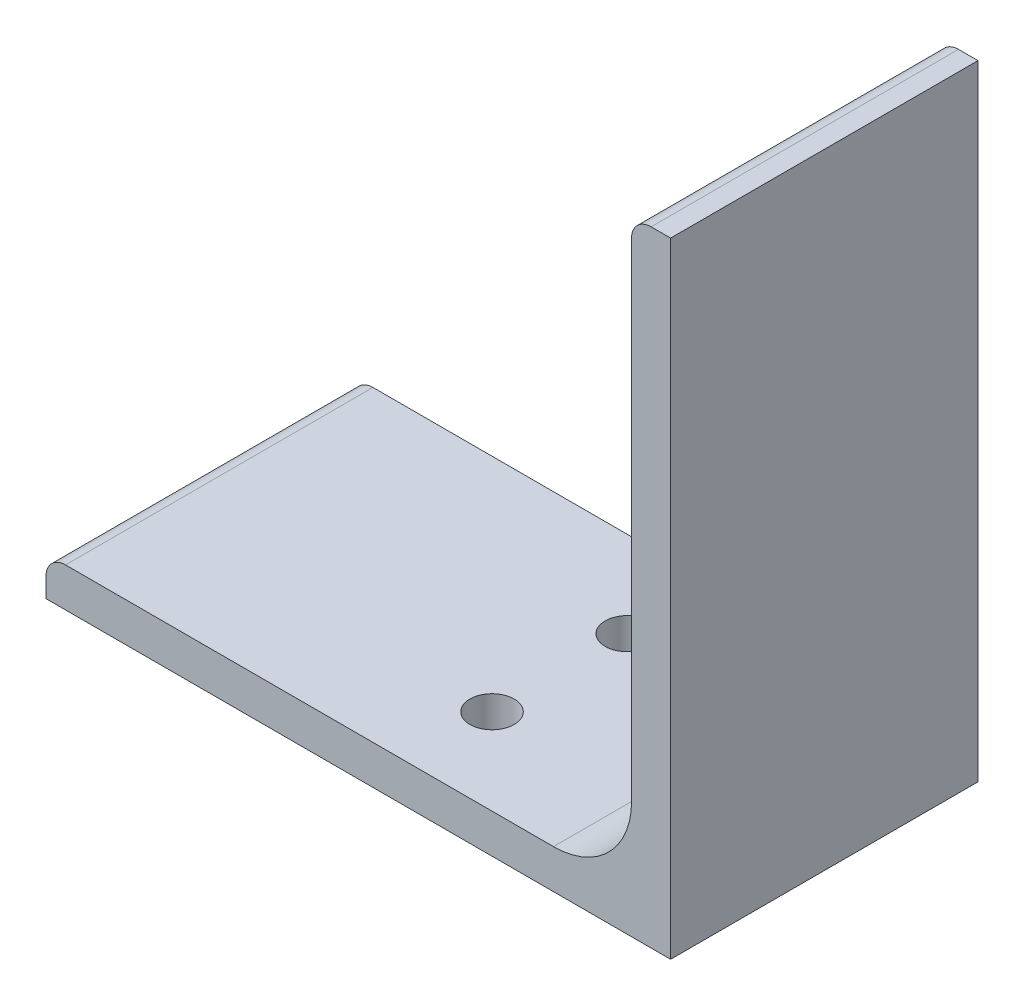
ISO-10303-21;
HEADER;
FILE_DESCRIPTION(('STEP AP214'),'2;1');
FILE_NAME('part.step','',(''),(''),'','','');
FILE_SCHEMA(('AUTOMOTIVE_DESIGN { 1 0 10303 214 1 1 1 1 }'));
ENDSEC;
DATA;
#1=APPLICATION_CONTEXT('core data for automotive mechanical design processes');
#2=APPLICATION_PROTOCOL_DEFINITION('international standard','automotive_design',2000,#1);
#3=PRODUCT_CONTEXT('',#1,'mechanical');
#4=PRODUCT('Part','Part','',(#3));
#5=PRODUCT_RELATED_PRODUCT_CATEGORY('part','',(#4));
#6=PRODUCT_DEFINITION_FORMATION('','',#4);
#7=PRODUCT_DEFINITION_CONTEXT('part definition',#1,'design');
#8=PRODUCT_DEFINITION('design','',#6,#7);
#9=PRODUCT_DEFINITION_SHAPE('','',#8);
#10=(LENGTH_UNIT() NAMED_UNIT(*) SI_UNIT(.MILLI.,.METRE.));
#11=(NAMED_UNIT(*) PLANE_ANGLE_UNIT() SI_UNIT($,.RADIAN.));
#12=(NAMED_UNIT(*) SI_UNIT($,.STERADIAN.) SOLID_ANGLE_UNIT());
#13=UNCERTAINTY_MEASURE_WITH_UNIT(LENGTH_MEASURE(1.E-05),#10,'distance_accuracy_value','');
#14=(GEOMETRIC_REPRESENTATION_CONTEXT(3) GLOBAL_UNCERTAINTY_ASSIGNED_CONTEXT((#13)) GLOBAL_UNIT_ASSIGNED_CONTEXT((#10,
#11,#12)) REPRESENTATION_CONTEXT('',''));
#15=CARTESIAN_POINT('',(0.,0.,0.));
#16=DIRECTION('',(0.,0.,1.));
#17=DIRECTION('',(1.,0.,0.));
#18=AXIS2_PLACEMENT_3D('',#15,#16,#17);
#19=CARTESIAN_POINT('',(-25.4,-23.8125,12.500000019));
#20=DIRECTION('',(1.,0.,0.));
#21=DIRECTION('',(0.,1.,0.));
#22=AXIS2_PLACEMENT_3D('',#19,#20,#21);
#23=PLANE('',#22);
#24=DIRECTION('',(0.,-1.,0.));
#25=VECTOR('',#24,1.);
#26=CARTESIAN_POINT('',(-25.4,-23.8125,-12.500000019));
#27=LINE('',#26,#25);
#28=CARTESIAN_POINT('',(-25.4,-23.8125,-12.500000019));
#29=VERTEX_POINT('',#28);
#30=CARTESIAN_POINT('',(-25.4,-25.4,-12.500000019));
#31=VERTEX_POINT('',#30);
#32=EDGE_CURVE('E137',#29,#31,#27,.T.);
#33=ORIENTED_EDGE('',*,*,#32,.T.);
#34=DIRECTION('',(0.,0.,-1.));
#35=VECTOR('',#34,1.);
#36=CARTESIAN_POINT('',(-25.4,-25.4,12.500000019));
#37=LINE('',#36,#35);
#38=CARTESIAN_POINT('',(-25.4,-25.4,12.500000019));
#39=VERTEX_POINT('',#38);
#40=EDGE_CURVE('E11',#39,#31,#37,.T.);
#41=ORIENTED_EDGE('',*,*,#40,.F.);
#42=DIRECTION('',(0.,-1.,0.));
#43=VECTOR('',#42,1.);
#44=CARTESIAN_POINT('',(-25.4,-23.8125,12.500000019));
#45=LINE('',#44,#43);
#46=CARTESIAN_POINT('',(-25.4,-23.8125,12.500000019));
#47=VERTEX_POINT('',#46);
#48=EDGE_CURVE('E154',#47,#39,#45,.T.);
#49=ORIENTED_EDGE('',*,*,#48,.F.);
#50=DIRECTION('',(0.,0.,-1.));
#51=VECTOR('',#50,1.);
#52=CARTESIAN_POINT('',(-25.4,-23.8125,12.500000019));
#53=LINE('',#52,#51);
#54=EDGE_CURVE('E133',#47,#29,#53,.T.);
#55=ORIENTED_EDGE('',*,*,#54,.T.);
#56=EDGE_LOOP('',(#33,#41,#49,#55));
#57=FACE_BOUND('',#56,.T.);
#58=ADVANCED_FACE('F35',(#57),#23,.F.);
#59=CARTESIAN_POINT('',(-25.4,-25.4,12.500000019));
#60=DIRECTION('',(0.,1.,0.));
#61=DIRECTION('',(-1.,0.,0.));
#62=AXIS2_PLACEMENT_3D('',#59,#60,#61);
#63=PLANE('',#62);
#64=CARTESIAN_POINT('',(3.87500012399999,-25.4,-5.500000049));
#65=DIRECTION('',(0.,1.,0.));
#66=DIRECTION('',(0.,0.,1.));
#67=AXIS2_PLACEMENT_3D('',#64,#65,#66);
#68=CIRCLE('',#67,1.8);
#69=CARTESIAN_POINT('',(3.87500012399999,-25.4,-3.700000049));
#70=VERTEX_POINT('',#69);
#71=EDGE_CURVE('E200',#70,#70,#68,.T.);
#72=ORIENTED_EDGE('',*,*,#71,.T.);
#73=EDGE_LOOP('',(#72));
#74=FACE_BOUND('',#73,.T.);
#75=CARTESIAN_POINT('',(3.87500012399999,-25.4,5.500000049));
#76=DIRECTION('',(0.,1.,0.));
#77=DIRECTION('',(0.,0.,1.));
#78=AXIS2_PLACEMENT_3D('',#75,#76,#77);
#79=CIRCLE('',#78,1.8);
#80=CARTESIAN_POINT('',(3.87500012399999,-25.4,7.300000049));
#81=VERTEX_POINT('',#80);
#82=EDGE_CURVE('E141',#81,#81,#79,.T.);
#83=ORIENTED_EDGE('',*,*,#82,.T.);
#84=EDGE_LOOP('',(#83));
#85=FACE_BOUND('',#84,.T.);
#86=DIRECTION('',(1.,0.,0.));
#87=VECTOR('',#86,1.);
#88=CARTESIAN_POINT('',(-25.4,-25.4,-12.500000019));
#89=LINE('',#88,#87);
#90=CARTESIAN_POINT('',(25.4,-25.4,-12.500000019));
#91=VERTEX_POINT('',#90);
#92=EDGE_CURVE('E140',#31,#91,#89,.T.);
#93=ORIENTED_EDGE('',*,*,#92,.T.);
#94=DIRECTION('',(0.,0.,-1.));
#95=VECTOR('',#94,1.);
#96=CARTESIAN_POINT('',(25.4,-25.4,12.500000019));
#97=LINE('',#96,#95);
#98=CARTESIAN_POINT('',(25.4,-25.4,12.500000019));
#99=VERTEX_POINT('',#98);
#100=EDGE_CURVE('E43',#99,#91,#97,.T.);
#101=ORIENTED_EDGE('',*,*,#100,.F.);
#102=DIRECTION('',(1.,0.,0.));
#103=VECTOR('',#102,1.);
#104=CARTESIAN_POINT('',(-25.4,-25.4,12.500000019));
#105=LINE('',#104,#103);
#106=EDGE_CURVE('E97',#39,#99,#105,.T.);
#107=ORIENTED_EDGE('',*,*,#106,.F.);
#108=ORIENTED_EDGE('',*,*,#40,.T.);
#109=EDGE_LOOP('',(#93,#101,#107,#108));
#110=FACE_BOUND('',#109,.T.);
#111=ADVANCED_FACE('F229',(#74,#85,#110),#63,.F.);
#112=CARTESIAN_POINT('',(25.4,-25.4,12.500000019));
#113=DIRECTION('',(-1.,0.,0.));
#114=DIRECTION('',(0.,-1.,0.));
#115=AXIS2_PLACEMENT_3D('',#112,#113,#114);
#116=PLANE('',#115);
#117=DIRECTION('',(0.,1.,0.));
#118=VECTOR('',#117,1.);
#119=CARTESIAN_POINT('',(25.4,-25.4,-12.500000019));
#120=LINE('',#119,#118);
#121=CARTESIAN_POINT('',(25.4,25.4,-12.500000019));
#122=VERTEX_POINT('',#121);
#123=EDGE_CURVE('E143',#91,#122,#120,.T.);
#124=ORIENTED_EDGE('',*,*,#123,.T.);
#125=DIRECTION('',(0.,0.,-1.));
#126=VECTOR('',#125,1.);
#127=CARTESIAN_POINT('',(25.4,25.4,12.500000019));
#128=LINE('',#127,#126);
#129=CARTESIAN_POINT('',(25.4,25.4,12.500000019));
#130=VERTEX_POINT('',#129);
#131=EDGE_CURVE('E164',#130,#122,#128,.T.);
#132=ORIENTED_EDGE('',*,*,#131,.F.);
#133=DIRECTION('',(0.,1.,0.));
#134=VECTOR('',#133,1.);
#135=CARTESIAN_POINT('',(25.4,-25.4,12.500000019));
#136=LINE('',#135,#134);
#137=EDGE_CURVE('E172',#99,#130,#136,.T.);
#138=ORIENTED_EDGE('',*,*,#137,.F.);
#139=ORIENTED_EDGE('',*,*,#100,.T.);
#140=EDGE_LOOP('',(#124,#132,#138,#139));
#141=FACE_BOUND('',#140,.T.);
#142=ADVANCED_FACE('F170',(#141),#116,.F.);
#143=CARTESIAN_POINT('',(23.8125,25.4,12.500000019));
#144=DIRECTION('',(0.,-1.,0.));
#145=DIRECTION('',(1.,0.,0.));
#146=AXIS2_PLACEMENT_3D('',#143,#144,#145);
#147=PLANE('',#146);
#148=DIRECTION('',(-1.,0.,0.));
#149=VECTOR('',#148,1.);
#150=CARTESIAN_POINT('',(23.8125,25.4,-12.500000019));
#151=LINE('',#150,#149);
#152=CARTESIAN_POINT('',(23.8125,25.4,-12.500000019));
#153=VERTEX_POINT('',#152);
#154=EDGE_CURVE('E145',#122,#153,#151,.T.);
#155=ORIENTED_EDGE('',*,*,#154,.T.);
#156=DIRECTION('',(0.,0.,-1.));
#157=VECTOR('',#156,1.);
#158=CARTESIAN_POINT('',(23.8125,25.4,12.500000019));
#159=LINE('',#158,#157);
#160=CARTESIAN_POINT('',(23.8125,25.4,12.500000019));
#161=VERTEX_POINT('',#160);
#162=EDGE_CURVE('E161',#161,#153,#159,.T.);
#163=ORIENTED_EDGE('',*,*,#162,.F.);
#164=DIRECTION('',(-1.,0.,0.));
#165=VECTOR('',#164,1.);
#166=CARTESIAN_POINT('',(23.8125,25.4,12.500000019));
#167=LINE('',#166,#165);
#168=EDGE_CURVE('E188',#130,#161,#167,.T.);
#169=ORIENTED_EDGE('',*,*,#168,.F.);
#170=ORIENTED_EDGE('',*,*,#131,.T.);
#171=EDGE_LOOP('',(#155,#163,#169,#170));
#172=FACE_BOUND('',#171,.T.);
#173=ADVANCED_FACE('F181',(#172),#147,.F.);
#174=CARTESIAN_POINT('',(23.8125,23.8125,12.500000019));
#175=DIRECTION('',(0.,0.,-1.));
#176=DIRECTION('',(-1.,0.,0.));
#177=AXIS2_PLACEMENT_3D('',#174,#175,#176);
#178=CYLINDRICAL_SURFACE('',#177,1.58750000000001);
#179=CARTESIAN_POINT('',(23.8125,23.8125,-12.500000019));
#180=DIRECTION('',(0.,0.,1.));
#181=DIRECTION('',(-1.,0.,0.));
#182=AXIS2_PLACEMENT_3D('',#179,#180,#181);
#183=CIRCLE('',#182,1.58750000000001);
#184=CARTESIAN_POINT('',(22.225,23.8125,-12.500000019));
#185=VERTEX_POINT('',#184);
#186=EDGE_CURVE('E147',#153,#185,#183,.T.);
#187=ORIENTED_EDGE('',*,*,#186,.T.);
#188=DIRECTION('',(0.,0.,-1.));
#189=VECTOR('',#188,1.);
#190=CARTESIAN_POINT('',(22.225,23.8125,12.500000019));
#191=LINE('',#190,#189);
#192=CARTESIAN_POINT('',(22.225,23.8125,12.500000019));
#193=VERTEX_POINT('',#192);
#194=EDGE_CURVE('E158',#193,#185,#191,.T.);
#195=ORIENTED_EDGE('',*,*,#194,.F.);
#196=CARTESIAN_POINT('',(23.8125,23.8125,12.500000019));
#197=DIRECTION('',(0.,0.,1.));
#198=DIRECTION('',(-1.,0.,0.));
#199=AXIS2_PLACEMENT_3D('',#196,#197,#198);
#200=CIRCLE('',#199,1.58750000000001);
#201=EDGE_CURVE('E187',#161,#193,#200,.T.);
#202=ORIENTED_EDGE('',*,*,#201,.F.);
#203=ORIENTED_EDGE('',*,*,#162,.T.);
#204=EDGE_LOOP('',(#187,#195,#202,#203));
#205=FACE_BOUND('',#204,.T.);
#206=ADVANCED_FACE('F185',(#205),#178,.T.);
#207=CARTESIAN_POINT('',(22.225,23.8125,12.500000019));
#208=DIRECTION('',(1.,0.,0.));
#209=DIRECTION('',(0.,1.,0.));
#210=AXIS2_PLACEMENT_3D('',#207,#208,#209);
#211=PLANE('',#210);
#212=DIRECTION('',(0.,-1.,0.));
#213=VECTOR('',#212,1.);
#214=CARTESIAN_POINT('',(22.225,23.8125,-12.500000019));
#215=LINE('',#214,#213);
#216=CARTESIAN_POINT('',(22.225,-15.875,-12.500000019));
#217=VERTEX_POINT('',#216);
#218=EDGE_CURVE('E149',#185,#217,#215,.T.);
#219=ORIENTED_EDGE('',*,*,#218,.T.);
#220=DIRECTION('',(0.,0.,-1.));
#221=VECTOR('',#220,1.);
#222=CARTESIAN_POINT('',(22.225,-15.875,12.500000019));
#223=LINE('',#222,#221);
#224=CARTESIAN_POINT('',(22.225,-15.875,12.500000019));
#225=VERTEX_POINT('',#224);
#226=EDGE_CURVE('E128',#225,#217,#223,.T.);
#227=ORIENTED_EDGE('',*,*,#226,.F.);
#228=DIRECTION('',(0.,-1.,0.));
#229=VECTOR('',#228,1.);
#230=CARTESIAN_POINT('',(22.225,23.8125,12.500000019));
#231=LINE('',#230,#229);
#232=EDGE_CURVE('E119',#193,#225,#231,.T.);
#233=ORIENTED_EDGE('',*,*,#232,.F.);
#234=ORIENTED_EDGE('',*,*,#194,.T.);
#235=EDGE_LOOP('',(#219,#227,#233,#234));
#236=FACE_BOUND('',#235,.T.);
#237=ADVANCED_FACE('F238',(#236),#211,.F.);
#238=CARTESIAN_POINT('',(15.875,-15.875,12.500000019));
#239=DIRECTION('',(0.,0.,-1.));
#240=DIRECTION('',(-1.,0.,0.));
#241=AXIS2_PLACEMENT_3D('',#238,#239,#240);
#242=CYLINDRICAL_SURFACE('',#241,6.35);
#243=CARTESIAN_POINT('',(15.875,-15.875,-12.500000019));
#244=DIRECTION('',(0.,0.,-1.));
#245=DIRECTION('',(-1.,0.,0.));
#246=AXIS2_PLACEMENT_3D('',#243,#244,#245);
#247=CIRCLE('',#246,6.35);
#248=CARTESIAN_POINT('',(15.875,-22.225,-12.500000019));
#249=VERTEX_POINT('',#248);
#250=EDGE_CURVE('E127',#217,#249,#247,.T.);
#251=ORIENTED_EDGE('',*,*,#250,.T.);
#252=DIRECTION('',(0.,0.,-1.));
#253=VECTOR('',#252,1.);
#254=CARTESIAN_POINT('',(15.875,-22.225,12.500000019));
#255=LINE('',#254,#253);
#256=CARTESIAN_POINT('',(15.875,-22.225,12.500000019));
#257=VERTEX_POINT('',#256);
#258=EDGE_CURVE('E124',#257,#249,#255,.T.);
#259=ORIENTED_EDGE('',*,*,#258,.F.);
#260=CARTESIAN_POINT('',(15.875,-15.875,12.500000019));
#261=DIRECTION('',(0.,0.,-1.));
#262=DIRECTION('',(-1.,0.,0.));
#263=AXIS2_PLACEMENT_3D('',#260,#261,#262);
#264=CIRCLE('',#263,6.35);
#265=EDGE_CURVE('E113',#225,#257,#264,.T.);
#266=ORIENTED_EDGE('',*,*,#265,.F.);
#267=ORIENTED_EDGE('',*,*,#226,.T.);
#268=EDGE_LOOP('',(#251,#259,#266,#267));
#269=FACE_BOUND('',#268,.T.);
#270=ADVANCED_FACE('F125',(#269),#242,.F.);
#271=CARTESIAN_POINT('',(15.875,-22.225,12.500000019));
#272=DIRECTION('',(0.,-1.,0.));
#273=DIRECTION('',(0.,0.,-1.));
#274=AXIS2_PLACEMENT_3D('',#271,#272,#273);
#275=PLANE('',#274);
#276=CARTESIAN_POINT('',(3.87500012399999,-22.225,-5.500000049));
#277=DIRECTION('',(0.,1.,0.));
#278=DIRECTION('',(0.,0.,1.));
#279=AXIS2_PLACEMENT_3D('',#276,#277,#278);
#280=CIRCLE('',#279,1.8);
#281=CARTESIAN_POINT('',(3.87500012399999,-22.225,-3.700000049));
#282=VERTEX_POINT('',#281);
#283=EDGE_CURVE('E203',#282,#282,#280,.T.);
#284=ORIENTED_EDGE('',*,*,#283,.F.);
#285=EDGE_LOOP('',(#284));
#286=FACE_BOUND('',#285,.T.);
#287=CARTESIAN_POINT('',(3.87500012399999,-22.225,5.500000049));
#288=DIRECTION('',(0.,1.,0.));
#289=DIRECTION('',(0.,0.,1.));
#290=AXIS2_PLACEMENT_3D('',#287,#288,#289);
#291=CIRCLE('',#290,1.8);
#292=CARTESIAN_POINT('',(3.87500012399999,-22.225,7.300000049));
#293=VERTEX_POINT('',#292);
#294=EDGE_CURVE('E197',#293,#293,#291,.T.);
#295=ORIENTED_EDGE('',*,*,#294,.F.);
#296=EDGE_LOOP('',(#295));
#297=FACE_BOUND('',#296,.T.);
#298=DIRECTION('',(-1.,0.,0.));
#299=VECTOR('',#298,1.);
#300=CARTESIAN_POINT('',(15.875,-22.225,-12.500000019));
#301=LINE('',#300,#299);
#302=CARTESIAN_POINT('',(-23.8125,-22.225,-12.500000019));
#303=VERTEX_POINT('',#302);
#304=EDGE_CURVE('E83',#249,#303,#301,.T.);
#305=ORIENTED_EDGE('',*,*,#304,.T.);
#306=DIRECTION('',(0.,0.,-1.));
#307=VECTOR('',#306,1.);
#308=CARTESIAN_POINT('',(-23.8125,-22.225,12.500000019));
#309=LINE('',#308,#307);
#310=CARTESIAN_POINT('',(-23.8125,-22.225,12.500000019));
#311=VERTEX_POINT('',#310);
#312=EDGE_CURVE('E129',#311,#303,#309,.T.);
#313=ORIENTED_EDGE('',*,*,#312,.F.);
#314=DIRECTION('',(-1.,0.,0.));
#315=VECTOR('',#314,1.);
#316=CARTESIAN_POINT('',(15.875,-22.225,12.500000019));
#317=LINE('',#316,#315);
#318=EDGE_CURVE('E117',#257,#311,#317,.T.);
#319=ORIENTED_EDGE('',*,*,#318,.F.);
#320=ORIENTED_EDGE('',*,*,#258,.T.);
#321=EDGE_LOOP('',(#305,#313,#319,#320));
#322=FACE_BOUND('',#321,.T.);
#323=ADVANCED_FACE('F131',(#286,#297,#322),#275,.F.);
#324=CARTESIAN_POINT('',(-23.8125,-23.8125,12.500000019));
#325=DIRECTION('',(0.,0.,-1.));
#326=DIRECTION('',(-1.,0.,0.));
#327=AXIS2_PLACEMENT_3D('',#324,#325,#326);
#328=CYLINDRICAL_SURFACE('',#327,1.5875);
#329=CARTESIAN_POINT('',(-23.8125,-23.8125,-12.500000019));
#330=DIRECTION('',(0.,0.,1.));
#331=DIRECTION('',(-1.,0.,0.));
#332=AXIS2_PLACEMENT_3D('',#329,#330,#331);
#333=CIRCLE('',#332,1.5875);
#334=EDGE_CURVE('E89',#303,#29,#333,.T.);
#335=ORIENTED_EDGE('',*,*,#334,.T.);
#336=ORIENTED_EDGE('',*,*,#54,.F.);
#337=CARTESIAN_POINT('',(-23.8125,-23.8125,12.500000019));
#338=DIRECTION('',(0.,0.,1.));
#339=DIRECTION('',(-1.,0.,0.));
#340=AXIS2_PLACEMENT_3D('',#337,#338,#339);
#341=CIRCLE('',#340,1.5875);
#342=EDGE_CURVE('E51',#311,#47,#341,.T.);
#343=ORIENTED_EDGE('',*,*,#342,.F.);
#344=ORIENTED_EDGE('',*,*,#312,.T.);
#345=EDGE_LOOP('',(#335,#336,#343,#344));
#346=FACE_BOUND('',#345,.T.);
#347=ADVANCED_FACE('F211',(#346),#328,.T.);
#348=CARTESIAN_POINT('',(23.8125,23.8125,12.500000019));
#349=DIRECTION('',(0.,0.,-1.));
#350=DIRECTION('',(-1.,0.,0.));
#351=AXIS2_PLACEMENT_3D('',#348,#349,#350);
#352=PLANE('',#351);
#353=ORIENTED_EDGE('',*,*,#48,.T.);
#354=ORIENTED_EDGE('',*,*,#106,.T.);
#355=ORIENTED_EDGE('',*,*,#137,.T.);
#356=ORIENTED_EDGE('',*,*,#168,.T.);
#357=ORIENTED_EDGE('',*,*,#201,.T.);
#358=ORIENTED_EDGE('',*,*,#232,.T.);
#359=ORIENTED_EDGE('',*,*,#265,.T.);
#360=ORIENTED_EDGE('',*,*,#318,.T.);
#361=ORIENTED_EDGE('',*,*,#342,.T.);
#362=EDGE_LOOP('',(#353,#354,#355,#356,#357,#358,#359,#360,#361));
#363=FACE_BOUND('',#362,.T.);
#364=ADVANCED_FACE('F115',(#363),#352,.F.);
#365=CARTESIAN_POINT('',(23.8125,23.8125,-12.500000019));
#366=DIRECTION('',(0.,0.,-1.));
#367=DIRECTION('',(-1.,0.,0.));
#368=AXIS2_PLACEMENT_3D('',#365,#366,#367);
#369=PLANE('',#368);
#370=ORIENTED_EDGE('',*,*,#32,.F.);
#371=ORIENTED_EDGE('',*,*,#334,.F.);
#372=ORIENTED_EDGE('',*,*,#304,.F.);
#373=ORIENTED_EDGE('',*,*,#250,.F.);
#374=ORIENTED_EDGE('',*,*,#218,.F.);
#375=ORIENTED_EDGE('',*,*,#186,.F.);
#376=ORIENTED_EDGE('',*,*,#154,.F.);
#377=ORIENTED_EDGE('',*,*,#123,.F.);
#378=ORIENTED_EDGE('',*,*,#92,.F.);
#379=EDGE_LOOP('',(#370,#371,#372,#373,#374,#375,#376,#377,#378));
#380=FACE_BOUND('',#379,.T.);
#381=ADVANCED_FACE('F176',(#380),#369,.T.);
#382=CARTESIAN_POINT('',(3.87500012399999,-22.225,5.500000049));
#383=DIRECTION('',(0.,1.,0.));
#384=DIRECTION('',(0.,0.,1.));
#385=AXIS2_PLACEMENT_3D('',#382,#383,#384);
#386=CYLINDRICAL_SURFACE('',#385,1.8);
#387=ORIENTED_EDGE('',*,*,#82,.F.);
#388=EDGE_LOOP('',(#387));
#389=FACE_BOUND('',#388,.T.);
#390=ORIENTED_EDGE('',*,*,#294,.T.);
#391=EDGE_LOOP('',(#390));
#392=FACE_BOUND('',#391,.T.);
#393=ADVANCED_FACE('F215',(#389,#392),#386,.F.);
#394=CARTESIAN_POINT('',(3.87500012399999,-22.225,-5.500000049));
#395=DIRECTION('',(0.,1.,0.));
#396=DIRECTION('',(0.,0.,1.));
#397=AXIS2_PLACEMENT_3D('',#394,#395,#396);
#398=CYLINDRICAL_SURFACE('',#397,1.8);
#399=ORIENTED_EDGE('',*,*,#71,.F.);
#400=EDGE_LOOP('',(#399));
#401=FACE_BOUND('',#400,.T.);
#402=ORIENTED_EDGE('',*,*,#283,.T.);
#403=EDGE_LOOP('',(#402));
#404=FACE_BOUND('',#403,.T.);
#405=ADVANCED_FACE('F207',(#401,#404),#398,.F.);
#406=CLOSED_SHELL('',(#58,#111,#142,#173,#206,#237,#270,#323,#347,#364,#381,#393,#405));
#407=MANIFOLD_SOLID_BREP('B2',#406);
#408=ADVANCED_BREP_SHAPE_REPRESENTATION('',(#18,#407),#14);
#409=SHAPE_DEFINITION_REPRESENTATION(#9,#408);
ENDSEC;
END-ISO-10303-21;
